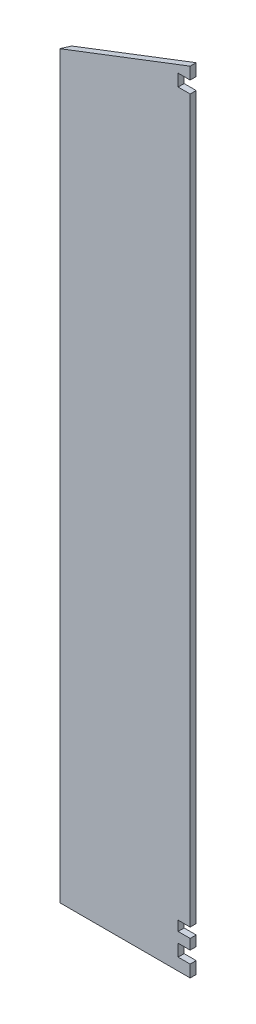
ISO-10303-21;
HEADER;
FILE_DESCRIPTION(('STEP AP214'),'2;1');
FILE_NAME('part.step','',(''),(''),'','','');
FILE_SCHEMA(('AUTOMOTIVE_DESIGN { 1 0 10303 214 1 1 1 1 }'));
ENDSEC;
DATA;
#1=APPLICATION_CONTEXT('core data for automotive mechanical design processes');
#2=APPLICATION_PROTOCOL_DEFINITION('international standard','automotive_design',2000,#1);
#3=PRODUCT_CONTEXT('',#1,'mechanical');
#4=PRODUCT('Part','Part','',(#3));
#5=PRODUCT_RELATED_PRODUCT_CATEGORY('part','',(#4));
#6=PRODUCT_DEFINITION_FORMATION('','',#4);
#7=PRODUCT_DEFINITION_CONTEXT('part definition',#1,'design');
#8=PRODUCT_DEFINITION('design','',#6,#7);
#9=PRODUCT_DEFINITION_SHAPE('','',#8);
#10=(LENGTH_UNIT() NAMED_UNIT(*) SI_UNIT(.MILLI.,.METRE.));
#11=(NAMED_UNIT(*) PLANE_ANGLE_UNIT() SI_UNIT($,.RADIAN.));
#12=(NAMED_UNIT(*) SI_UNIT($,.STERADIAN.) SOLID_ANGLE_UNIT());
#13=UNCERTAINTY_MEASURE_WITH_UNIT(LENGTH_MEASURE(1.E-05),#10,'distance_accuracy_value','');
#14=(GEOMETRIC_REPRESENTATION_CONTEXT(3) GLOBAL_UNCERTAINTY_ASSIGNED_CONTEXT((#13)) GLOBAL_UNIT_ASSIGNED_CONTEXT((#10,
#11,#12)) REPRESENTATION_CONTEXT('',''));
#15=CARTESIAN_POINT('',(0.,0.,0.));
#16=DIRECTION('',(0.,0.,1.));
#17=DIRECTION('',(1.,0.,0.));
#18=AXIS2_PLACEMENT_3D('',#15,#16,#17);
#19=CARTESIAN_POINT('',(173.,-1048.1,16.));
#20=DIRECTION('',(-1.,0.,0.));
#21=DIRECTION('',(0.,0.,1.));
#22=AXIS2_PLACEMENT_3D('',#19,#20,#21);
#23=PLANE('',#22);
#24=DIRECTION('',(0.,1.,0.));
#25=VECTOR('',#24,1.);
#26=CARTESIAN_POINT('',(173.,-1048.1,0.));
#27=LINE('',#26,#25);
#28=CARTESIAN_POINT('',(173.,-984.1,0.));
#29=VERTEX_POINT('',#28);
#30=CARTESIAN_POINT('',(173.,-957.1,0.));
#31=VERTEX_POINT('',#30);
#32=EDGE_CURVE('E170',#29,#31,#27,.T.);
#33=ORIENTED_EDGE('',*,*,#32,.T.);
#34=DIRECTION('',(0.,0.,1.));
#35=VECTOR('',#34,1.);
#36=CARTESIAN_POINT('',(173.,-957.1,0.));
#37=LINE('',#36,#35);
#38=CARTESIAN_POINT('',(173.,-957.1,16.));
#39=VERTEX_POINT('',#38);
#40=EDGE_CURVE('E403',#31,#39,#37,.T.);
#41=ORIENTED_EDGE('',*,*,#40,.T.);
#42=DIRECTION('',(0.,1.,0.));
#43=VECTOR('',#42,1.);
#44=CARTESIAN_POINT('',(173.,-1048.1,16.));
#45=LINE('',#44,#43);
#46=CARTESIAN_POINT('',(173.,-984.1,16.));
#47=VERTEX_POINT('',#46);
#48=EDGE_CURVE('E228',#47,#39,#45,.T.);
#49=ORIENTED_EDGE('',*,*,#48,.F.);
#50=DIRECTION('',(0.,0.,1.));
#51=VECTOR('',#50,1.);
#52=CARTESIAN_POINT('',(173.,-984.1,0.));
#53=LINE('',#52,#51);
#54=EDGE_CURVE('E254',#29,#47,#53,.T.);
#55=ORIENTED_EDGE('',*,*,#54,.F.);
#56=EDGE_LOOP('',(#33,#41,#49,#55));
#57=FACE_BOUND('',#56,.T.);
#58=ADVANCED_FACE('F33',(#57),#23,.F.);
#59=CARTESIAN_POINT('',(173.,-1048.1,0.));
#60=VERTEX_POINT('',#59);
#61=CARTESIAN_POINT('',(173.,-1016.1,0.));
#62=VERTEX_POINT('',#61);
#63=EDGE_CURVE('E173',#60,#62,#27,.T.);
#64=ORIENTED_EDGE('',*,*,#63,.T.);
#65=DIRECTION('',(0.,0.,1.));
#66=VECTOR('',#65,1.);
#67=CARTESIAN_POINT('',(173.,-1016.1,0.));
#68=LINE('',#67,#66);
#69=CARTESIAN_POINT('',(173.,-1016.1,16.));
#70=VERTEX_POINT('',#69);
#71=EDGE_CURVE('E237',#62,#70,#68,.T.);
#72=ORIENTED_EDGE('',*,*,#71,.T.);
#73=CARTESIAN_POINT('',(173.,-1048.1,16.));
#74=VERTEX_POINT('',#73);
#75=EDGE_CURVE('E225',#74,#70,#45,.T.);
#76=ORIENTED_EDGE('',*,*,#75,.F.);
#77=DIRECTION('',(0.,0.,-1.));
#78=VECTOR('',#77,1.);
#79=CARTESIAN_POINT('',(173.,-1048.1,16.));
#80=LINE('',#79,#78);
#81=EDGE_CURVE('E193',#74,#60,#80,.T.);
#82=ORIENTED_EDGE('',*,*,#81,.T.);
#83=EDGE_LOOP('',(#64,#72,#76,#82));
#84=FACE_BOUND('',#83,.T.);
#85=ADVANCED_FACE('F236',(#84),#23,.F.);
#86=CARTESIAN_POINT('',(173.,-931.1,16.));
#87=VERTEX_POINT('',#86);
#88=CARTESIAN_POINT('',(173.,984.1,16.));
#89=VERTEX_POINT('',#88);
#90=EDGE_CURVE('E161',#87,#89,#45,.T.);
#91=ORIENTED_EDGE('',*,*,#90,.F.);
#92=DIRECTION('',(0.,0.,1.));
#93=VECTOR('',#92,1.);
#94=CARTESIAN_POINT('',(173.,-931.1,0.));
#95=LINE('',#94,#93);
#96=CARTESIAN_POINT('',(173.,-931.1,0.));
#97=VERTEX_POINT('',#96);
#98=EDGE_CURVE('E148',#97,#87,#95,.T.);
#99=ORIENTED_EDGE('',*,*,#98,.F.);
#100=CARTESIAN_POINT('',(173.,984.1,0.));
#101=VERTEX_POINT('',#100);
#102=EDGE_CURVE('E159',#97,#101,#27,.T.);
#103=ORIENTED_EDGE('',*,*,#102,.T.);
#104=DIRECTION('',(0.,0.,1.));
#105=VECTOR('',#104,1.);
#106=CARTESIAN_POINT('',(173.,984.1,0.));
#107=LINE('',#106,#105);
#108=EDGE_CURVE('E217',#101,#89,#107,.T.);
#109=ORIENTED_EDGE('',*,*,#108,.T.);
#110=EDGE_LOOP('',(#91,#99,#103,#109));
#111=FACE_BOUND('',#110,.T.);
#112=ADVANCED_FACE('F157',(#111),#23,.F.);
#113=CARTESIAN_POINT('',(173.,1016.1,16.));
#114=VERTEX_POINT('',#113);
#115=CARTESIAN_POINT('',(173.,1048.1,16.));
#116=VERTEX_POINT('',#115);
#117=EDGE_CURVE('E190',#114,#116,#45,.T.);
#118=ORIENTED_EDGE('',*,*,#117,.F.);
#119=DIRECTION('',(0.,0.,1.));
#120=VECTOR('',#119,1.);
#121=CARTESIAN_POINT('',(173.,1016.1,0.));
#122=LINE('',#121,#120);
#123=CARTESIAN_POINT('',(173.,1016.1,0.));
#124=VERTEX_POINT('',#123);
#125=EDGE_CURVE('E204',#124,#114,#122,.T.);
#126=ORIENTED_EDGE('',*,*,#125,.F.);
#127=CARTESIAN_POINT('',(173.,1048.1,0.));
#128=VERTEX_POINT('',#127);
#129=EDGE_CURVE('E171',#124,#128,#27,.T.);
#130=ORIENTED_EDGE('',*,*,#129,.T.);
#131=DIRECTION('',(0.,0.,-1.));
#132=VECTOR('',#131,1.);
#133=CARTESIAN_POINT('',(173.,1048.1,16.));
#134=LINE('',#133,#132);
#135=EDGE_CURVE('E41',#116,#128,#134,.T.);
#136=ORIENTED_EDGE('',*,*,#135,.F.);
#137=EDGE_LOOP('',(#118,#126,#130,#136));
#138=FACE_BOUND('',#137,.T.);
#139=ADVANCED_FACE('F35',(#138),#23,.F.);
#140=CARTESIAN_POINT('',(173.,1048.1,16.));
#141=DIRECTION('',(0.358367949545305,-0.9335804264972,0.));
#142=DIRECTION('',(0.9335804264972,0.358367949545305,0.));
#143=AXIS2_PLACEMENT_3D('',#140,#141,#142);
#144=PLANE('',#143);
#145=DIRECTION('',(-0.9335804264972,-0.358367949545305,0.));
#146=VECTOR('',#145,1.);
#147=CARTESIAN_POINT('',(173.,1048.1,0.));
#148=LINE('',#147,#146);
#149=CARTESIAN_POINT('',(-157.,921.424868438311,0.));
#150=VERTEX_POINT('',#149);
#151=EDGE_CURVE('E179',#128,#150,#148,.T.);
#152=ORIENTED_EDGE('',*,*,#151,.T.);
#153=DIRECTION('',(-0.682414773418215,-0.261954488492099,0.682414773418197));
#154=VECTOR('',#153,1.);
#155=CARTESIAN_POINT('',(11.8712866491245,986.248481933067,-168.87128664912));
#156=LINE('',#155,#154);
#157=CARTESIAN_POINT('',(-173.,915.283043877744,16.));
#158=VERTEX_POINT('',#157);
#159=EDGE_CURVE('E175',#150,#158,#156,.T.);
#160=ORIENTED_EDGE('',*,*,#159,.T.);
#161=DIRECTION('',(-0.9335804264972,-0.358367949545305,0.));
#162=VECTOR('',#161,1.);
#163=CARTESIAN_POINT('',(173.,1048.1,16.));
#164=LINE('',#163,#162);
#165=EDGE_CURVE('E199',#116,#158,#164,.T.);
#166=ORIENTED_EDGE('',*,*,#165,.F.);
#167=ORIENTED_EDGE('',*,*,#135,.T.);
#168=EDGE_LOOP('',(#152,#160,#166,#167));
#169=FACE_BOUND('',#168,.T.);
#170=ADVANCED_FACE('F197',(#169),#144,.F.);
#171=CARTESIAN_POINT('',(-173.,-1048.1,16.));
#172=DIRECTION('',(0.,1.,0.));
#173=DIRECTION('',(0.,0.,1.));
#174=AXIS2_PLACEMENT_3D('',#171,#172,#173);
#175=PLANE('',#174);
#176=DIRECTION('',(1.,0.,0.));
#177=VECTOR('',#176,1.);
#178=CARTESIAN_POINT('',(-173.,-1048.1,16.));
#179=LINE('',#178,#177);
#180=CARTESIAN_POINT('',(-173.,-1048.1,16.));
#181=VERTEX_POINT('',#180);
#182=EDGE_CURVE('E194',#181,#74,#179,.T.);
#183=ORIENTED_EDGE('',*,*,#182,.F.);
#184=DIRECTION('',(-0.707106781186557,0.,0.707106781186538));
#185=VECTOR('',#184,1.);
#186=CARTESIAN_POINT('',(-173.,-1048.1,16.));
#187=LINE('',#186,#185);
#188=CARTESIAN_POINT('',(-157.,-1048.1,0.));
#189=VERTEX_POINT('',#188);
#190=EDGE_CURVE('E211',#189,#181,#187,.T.);
#191=ORIENTED_EDGE('',*,*,#190,.F.);
#192=DIRECTION('',(1.,0.,0.));
#193=VECTOR('',#192,1.);
#194=CARTESIAN_POINT('',(-173.,-1048.1,0.));
#195=LINE('',#194,#193);
#196=EDGE_CURVE('E185',#189,#60,#195,.T.);
#197=ORIENTED_EDGE('',*,*,#196,.T.);
#198=ORIENTED_EDGE('',*,*,#81,.F.);
#199=EDGE_LOOP('',(#183,#191,#197,#198));
#200=FACE_BOUND('',#199,.T.);
#201=ADVANCED_FACE('F215',(#200),#175,.F.);
#202=CARTESIAN_POINT('',(0.,0.,16.));
#203=DIRECTION('',(0.,0.,-1.));
#204=DIRECTION('',(-1.,0.,0.));
#205=AXIS2_PLACEMENT_3D('',#202,#203,#204);
#206=PLANE('',#205);
#207=ORIENTED_EDGE('',*,*,#48,.T.);
#208=DIRECTION('',(1.,0.,0.));
#209=VECTOR('',#208,1.);
#210=CARTESIAN_POINT('',(173.,-957.1,16.));
#211=LINE('',#210,#209);
#212=CARTESIAN_POINT('',(141.,-957.1,16.));
#213=VERTEX_POINT('',#212);
#214=EDGE_CURVE('E153',#213,#39,#211,.T.);
#215=ORIENTED_EDGE('',*,*,#214,.F.);
#216=DIRECTION('',(0.,-1.,0.));
#217=VECTOR('',#216,1.);
#218=CARTESIAN_POINT('',(141.,-957.1,16.));
#219=LINE('',#218,#217);
#220=CARTESIAN_POINT('',(141.,-931.1,16.));
#221=VERTEX_POINT('',#220);
#222=EDGE_CURVE('E391',#221,#213,#219,.T.);
#223=ORIENTED_EDGE('',*,*,#222,.F.);
#224=DIRECTION('',(-1.,0.,0.));
#225=VECTOR('',#224,1.);
#226=CARTESIAN_POINT('',(141.,-931.1,16.));
#227=LINE('',#226,#225);
#228=EDGE_CURVE('E395',#87,#221,#227,.T.);
#229=ORIENTED_EDGE('',*,*,#228,.F.);
#230=ORIENTED_EDGE('',*,*,#90,.T.);
#231=DIRECTION('',(1.,0.,0.));
#232=VECTOR('',#231,1.);
#233=CARTESIAN_POINT('',(173.,984.1,16.));
#234=LINE('',#233,#232);
#235=CARTESIAN_POINT('',(141.,984.1,16.));
#236=VERTEX_POINT('',#235);
#237=EDGE_CURVE('E260',#236,#89,#234,.T.);
#238=ORIENTED_EDGE('',*,*,#237,.F.);
#239=DIRECTION('',(0.,-1.,0.));
#240=VECTOR('',#239,1.);
#241=CARTESIAN_POINT('',(141.,1016.1,16.));
#242=LINE('',#241,#240);
#243=CARTESIAN_POINT('',(141.,1016.1,16.));
#244=VERTEX_POINT('',#243);
#245=EDGE_CURVE('E245',#244,#236,#242,.T.);
#246=ORIENTED_EDGE('',*,*,#245,.F.);
#247=DIRECTION('',(-1.,0.,0.));
#248=VECTOR('',#247,1.);
#249=CARTESIAN_POINT('',(173.,1016.1,16.));
#250=LINE('',#249,#248);
#251=EDGE_CURVE('E241',#114,#244,#250,.T.);
#252=ORIENTED_EDGE('',*,*,#251,.F.);
#253=ORIENTED_EDGE('',*,*,#117,.T.);
#254=ORIENTED_EDGE('',*,*,#165,.T.);
#255=DIRECTION('',(0.,-1.,0.));
#256=VECTOR('',#255,1.);
#257=CARTESIAN_POINT('',(-173.,915.283043877744,16.));
#258=LINE('',#257,#256);
#259=EDGE_CURVE('E230',#158,#181,#258,.T.);
#260=ORIENTED_EDGE('',*,*,#259,.T.);
#261=ORIENTED_EDGE('',*,*,#182,.T.);
#262=ORIENTED_EDGE('',*,*,#75,.T.);
#263=DIRECTION('',(1.,0.,0.));
#264=VECTOR('',#263,1.);
#265=CARTESIAN_POINT('',(173.,-1016.1,16.));
#266=LINE('',#265,#264);
#267=CARTESIAN_POINT('',(141.,-1016.1,16.));
#268=VERTEX_POINT('',#267);
#269=EDGE_CURVE('E250',#268,#70,#266,.T.);
#270=ORIENTED_EDGE('',*,*,#269,.F.);
#271=DIRECTION('',(0.,-1.,0.));
#272=VECTOR('',#271,1.);
#273=CARTESIAN_POINT('',(141.,-984.1,16.));
#274=LINE('',#273,#272);
#275=CARTESIAN_POINT('',(141.,-984.1,16.));
#276=VERTEX_POINT('',#275);
#277=EDGE_CURVE('E414',#276,#268,#274,.T.);
#278=ORIENTED_EDGE('',*,*,#277,.F.);
#279=DIRECTION('',(-1.,0.,0.));
#280=VECTOR('',#279,1.);
#281=CARTESIAN_POINT('',(173.,-984.1,16.));
#282=LINE('',#281,#280);
#283=EDGE_CURVE('E405',#47,#276,#282,.T.);
#284=ORIENTED_EDGE('',*,*,#283,.F.);
#285=EDGE_LOOP('',(#207,#215,#223,#229,#230,#238,#246,#252,#253,#254,#260,#261,#262,#270,#278,#284));
#286=FACE_BOUND('',#285,.T.);
#287=ADVANCED_FACE('F233',(#286),#206,.F.);
#288=CARTESIAN_POINT('',(0.,0.,0.));
#289=DIRECTION('',(0.,0.,-1.));
#290=DIRECTION('',(-1.,0.,0.));
#291=AXIS2_PLACEMENT_3D('',#288,#289,#290);
#292=PLANE('',#291);
#293=DIRECTION('',(1.,0.,0.));
#294=VECTOR('',#293,1.);
#295=CARTESIAN_POINT('',(173.,-957.1,0.));
#296=LINE('',#295,#294);
#297=CARTESIAN_POINT('',(141.,-957.1,0.));
#298=VERTEX_POINT('',#297);
#299=EDGE_CURVE('E162',#298,#31,#296,.T.);
#300=ORIENTED_EDGE('',*,*,#299,.T.);
#301=ORIENTED_EDGE('',*,*,#32,.F.);
#302=DIRECTION('',(-1.,0.,0.));
#303=VECTOR('',#302,1.);
#304=CARTESIAN_POINT('',(173.,-984.1,0.));
#305=LINE('',#304,#303);
#306=CARTESIAN_POINT('',(141.,-984.1,0.));
#307=VERTEX_POINT('',#306);
#308=EDGE_CURVE('E408',#29,#307,#305,.T.);
#309=ORIENTED_EDGE('',*,*,#308,.T.);
#310=DIRECTION('',(0.,-1.,0.));
#311=VECTOR('',#310,1.);
#312=CARTESIAN_POINT('',(141.,-984.1,0.));
#313=LINE('',#312,#311);
#314=CARTESIAN_POINT('',(141.,-1016.1,0.));
#315=VERTEX_POINT('',#314);
#316=EDGE_CURVE('E56',#307,#315,#313,.T.);
#317=ORIENTED_EDGE('',*,*,#316,.T.);
#318=DIRECTION('',(1.,0.,0.));
#319=VECTOR('',#318,1.);
#320=CARTESIAN_POINT('',(173.,-1016.1,0.));
#321=LINE('',#320,#319);
#322=EDGE_CURVE('E256',#315,#62,#321,.T.);
#323=ORIENTED_EDGE('',*,*,#322,.T.);
#324=ORIENTED_EDGE('',*,*,#63,.F.);
#325=ORIENTED_EDGE('',*,*,#196,.F.);
#326=DIRECTION('',(0.,-1.,0.));
#327=VECTOR('',#326,1.);
#328=CARTESIAN_POINT('',(-157.,0.,0.));
#329=LINE('',#328,#327);
#330=EDGE_CURVE('E11',#150,#189,#329,.T.);
#331=ORIENTED_EDGE('',*,*,#330,.F.);
#332=ORIENTED_EDGE('',*,*,#151,.F.);
#333=ORIENTED_EDGE('',*,*,#129,.F.);
#334=DIRECTION('',(-1.,0.,0.));
#335=VECTOR('',#334,1.);
#336=CARTESIAN_POINT('',(173.,1016.1,0.));
#337=LINE('',#336,#335);
#338=CARTESIAN_POINT('',(141.,1016.1,0.));
#339=VERTEX_POINT('',#338);
#340=EDGE_CURVE('E257',#124,#339,#337,.T.);
#341=ORIENTED_EDGE('',*,*,#340,.T.);
#342=DIRECTION('',(0.,-1.,0.));
#343=VECTOR('',#342,1.);
#344=CARTESIAN_POINT('',(141.,1016.1,0.));
#345=LINE('',#344,#343);
#346=CARTESIAN_POINT('',(141.,984.1,0.));
#347=VERTEX_POINT('',#346);
#348=EDGE_CURVE('E259',#339,#347,#345,.T.);
#349=ORIENTED_EDGE('',*,*,#348,.T.);
#350=DIRECTION('',(1.,0.,0.));
#351=VECTOR('',#350,1.);
#352=CARTESIAN_POINT('',(173.,984.1,0.));
#353=LINE('',#352,#351);
#354=EDGE_CURVE('E169',#347,#101,#353,.T.);
#355=ORIENTED_EDGE('',*,*,#354,.T.);
#356=ORIENTED_EDGE('',*,*,#102,.F.);
#357=DIRECTION('',(-1.,0.,0.));
#358=VECTOR('',#357,1.);
#359=CARTESIAN_POINT('',(141.,-931.1,0.));
#360=LINE('',#359,#358);
#361=CARTESIAN_POINT('',(141.,-931.1,0.));
#362=VERTEX_POINT('',#361);
#363=EDGE_CURVE('E144',#97,#362,#360,.T.);
#364=ORIENTED_EDGE('',*,*,#363,.T.);
#365=DIRECTION('',(0.,-1.,0.));
#366=VECTOR('',#365,1.);
#367=CARTESIAN_POINT('',(141.,-957.1,0.));
#368=LINE('',#367,#366);
#369=EDGE_CURVE('E48',#362,#298,#368,.T.);
#370=ORIENTED_EDGE('',*,*,#369,.T.);
#371=EDGE_LOOP('',(#300,#301,#309,#317,#323,#324,#325,#331,#332,#333,#341,#349,#355,#356,#364,#370));
#372=FACE_BOUND('',#371,.T.);
#373=ADVANCED_FACE('F166',(#372),#292,.T.);
#374=CARTESIAN_POINT('',(-173.,1048.1,16.));
#375=DIRECTION('',(0.707106781186538,0.,0.707106781186557));
#376=DIRECTION('',(0.707106781186557,0.,-0.707106781186538));
#377=AXIS2_PLACEMENT_3D('',#374,#375,#376);
#378=PLANE('',#377);
#379=ORIENTED_EDGE('',*,*,#330,.T.);
#380=ORIENTED_EDGE('',*,*,#190,.T.);
#381=ORIENTED_EDGE('',*,*,#259,.F.);
#382=ORIENTED_EDGE('',*,*,#159,.F.);
#383=EDGE_LOOP('',(#379,#380,#381,#382));
#384=FACE_BOUND('',#383,.T.);
#385=ADVANCED_FACE('F210',(#384),#378,.F.);
#386=CARTESIAN_POINT('',(173.,984.1,0.));
#387=DIRECTION('',(0.,-1.,0.));
#388=DIRECTION('',(0.,0.,-1.));
#389=AXIS2_PLACEMENT_3D('',#386,#387,#388);
#390=PLANE('',#389);
#391=ORIENTED_EDGE('',*,*,#237,.T.);
#392=ORIENTED_EDGE('',*,*,#108,.F.);
#393=ORIENTED_EDGE('',*,*,#354,.F.);
#394=DIRECTION('',(0.,0.,1.));
#395=VECTOR('',#394,1.);
#396=CARTESIAN_POINT('',(141.,984.1,0.));
#397=LINE('',#396,#395);
#398=EDGE_CURVE('E220',#347,#236,#397,.T.);
#399=ORIENTED_EDGE('',*,*,#398,.T.);
#400=EDGE_LOOP('',(#391,#392,#393,#399));
#401=FACE_BOUND('',#400,.T.);
#402=ADVANCED_FACE('F277',(#401),#390,.F.);
#403=CARTESIAN_POINT('',(141.,1016.1,0.));
#404=DIRECTION('',(-1.,0.,0.));
#405=DIRECTION('',(0.,0.,1.));
#406=AXIS2_PLACEMENT_3D('',#403,#404,#405);
#407=PLANE('',#406);
#408=ORIENTED_EDGE('',*,*,#245,.T.);
#409=ORIENTED_EDGE('',*,*,#398,.F.);
#410=ORIENTED_EDGE('',*,*,#348,.F.);
#411=DIRECTION('',(0.,0.,1.));
#412=VECTOR('',#411,1.);
#413=CARTESIAN_POINT('',(141.,1016.1,0.));
#414=LINE('',#413,#412);
#415=EDGE_CURVE('E267',#339,#244,#414,.T.);
#416=ORIENTED_EDGE('',*,*,#415,.T.);
#417=EDGE_LOOP('',(#408,#409,#410,#416));
#418=FACE_BOUND('',#417,.T.);
#419=ADVANCED_FACE('F275',(#418),#407,.F.);
#420=CARTESIAN_POINT('',(173.,1016.1,0.));
#421=DIRECTION('',(0.,1.,0.));
#422=DIRECTION('',(0.,0.,1.));
#423=AXIS2_PLACEMENT_3D('',#420,#421,#422);
#424=PLANE('',#423);
#425=ORIENTED_EDGE('',*,*,#251,.T.);
#426=ORIENTED_EDGE('',*,*,#415,.F.);
#427=ORIENTED_EDGE('',*,*,#340,.F.);
#428=ORIENTED_EDGE('',*,*,#125,.T.);
#429=EDGE_LOOP('',(#425,#426,#427,#428));
#430=FACE_BOUND('',#429,.T.);
#431=ADVANCED_FACE('F272',(#430),#424,.F.);
#432=CARTESIAN_POINT('',(173.,-1016.1,0.));
#433=DIRECTION('',(0.,-1.,0.));
#434=DIRECTION('',(0.,0.,-1.));
#435=AXIS2_PLACEMENT_3D('',#432,#433,#434);
#436=PLANE('',#435);
#437=ORIENTED_EDGE('',*,*,#269,.T.);
#438=ORIENTED_EDGE('',*,*,#71,.F.);
#439=ORIENTED_EDGE('',*,*,#322,.F.);
#440=DIRECTION('',(0.,0.,1.));
#441=VECTOR('',#440,1.);
#442=CARTESIAN_POINT('',(141.,-1016.1,0.));
#443=LINE('',#442,#441);
#444=EDGE_CURVE('E242',#315,#268,#443,.T.);
#445=ORIENTED_EDGE('',*,*,#444,.T.);
#446=EDGE_LOOP('',(#437,#438,#439,#445));
#447=FACE_BOUND('',#446,.T.);
#448=ADVANCED_FACE('F332',(#447),#436,.F.);
#449=CARTESIAN_POINT('',(141.,-984.1,0.));
#450=DIRECTION('',(-1.,0.,0.));
#451=DIRECTION('',(0.,0.,1.));
#452=AXIS2_PLACEMENT_3D('',#449,#450,#451);
#453=PLANE('',#452);
#454=ORIENTED_EDGE('',*,*,#277,.T.);
#455=ORIENTED_EDGE('',*,*,#444,.F.);
#456=ORIENTED_EDGE('',*,*,#316,.F.);
#457=DIRECTION('',(0.,0.,1.));
#458=VECTOR('',#457,1.);
#459=CARTESIAN_POINT('',(141.,-984.1,0.));
#460=LINE('',#459,#458);
#461=EDGE_CURVE('E247',#307,#276,#460,.T.);
#462=ORIENTED_EDGE('',*,*,#461,.T.);
#463=EDGE_LOOP('',(#454,#455,#456,#462));
#464=FACE_BOUND('',#463,.T.);
#465=ADVANCED_FACE('F340',(#464),#453,.F.);
#466=CARTESIAN_POINT('',(173.,-984.1,0.));
#467=DIRECTION('',(0.,1.,0.));
#468=DIRECTION('',(0.,0.,1.));
#469=AXIS2_PLACEMENT_3D('',#466,#467,#468);
#470=PLANE('',#469);
#471=ORIENTED_EDGE('',*,*,#283,.T.);
#472=ORIENTED_EDGE('',*,*,#461,.F.);
#473=ORIENTED_EDGE('',*,*,#308,.F.);
#474=ORIENTED_EDGE('',*,*,#54,.T.);
#475=EDGE_LOOP('',(#471,#472,#473,#474));
#476=FACE_BOUND('',#475,.T.);
#477=ADVANCED_FACE('F348',(#476),#470,.F.);
#478=CARTESIAN_POINT('',(173.,-957.1,0.));
#479=DIRECTION('',(0.,-1.,0.));
#480=DIRECTION('',(0.,0.,-1.));
#481=AXIS2_PLACEMENT_3D('',#478,#479,#480);
#482=PLANE('',#481);
#483=ORIENTED_EDGE('',*,*,#214,.T.);
#484=ORIENTED_EDGE('',*,*,#40,.F.);
#485=ORIENTED_EDGE('',*,*,#299,.F.);
#486=DIRECTION('',(0.,0.,1.));
#487=VECTOR('',#486,1.);
#488=CARTESIAN_POINT('',(141.,-957.1,0.));
#489=LINE('',#488,#487);
#490=EDGE_CURVE('E393',#298,#213,#489,.T.);
#491=ORIENTED_EDGE('',*,*,#490,.T.);
#492=EDGE_LOOP('',(#483,#484,#485,#491));
#493=FACE_BOUND('',#492,.T.);
#494=ADVANCED_FACE('F356',(#493),#482,.F.);
#495=CARTESIAN_POINT('',(141.,-957.1,0.));
#496=DIRECTION('',(-1.,0.,0.));
#497=DIRECTION('',(0.,0.,1.));
#498=AXIS2_PLACEMENT_3D('',#495,#496,#497);
#499=PLANE('',#498);
#500=ORIENTED_EDGE('',*,*,#222,.T.);
#501=ORIENTED_EDGE('',*,*,#490,.F.);
#502=ORIENTED_EDGE('',*,*,#369,.F.);
#503=DIRECTION('',(0.,0.,1.));
#504=VECTOR('',#503,1.);
#505=CARTESIAN_POINT('',(141.,-931.1,0.));
#506=LINE('',#505,#504);
#507=EDGE_CURVE('E150',#362,#221,#506,.T.);
#508=ORIENTED_EDGE('',*,*,#507,.T.);
#509=EDGE_LOOP('',(#500,#501,#502,#508));
#510=FACE_BOUND('',#509,.T.);
#511=ADVANCED_FACE('F364',(#510),#499,.F.);
#512=CARTESIAN_POINT('',(141.,-931.1,0.));
#513=DIRECTION('',(0.,1.,0.));
#514=DIRECTION('',(0.,0.,1.));
#515=AXIS2_PLACEMENT_3D('',#512,#513,#514);
#516=PLANE('',#515);
#517=ORIENTED_EDGE('',*,*,#228,.T.);
#518=ORIENTED_EDGE('',*,*,#507,.F.);
#519=ORIENTED_EDGE('',*,*,#363,.F.);
#520=ORIENTED_EDGE('',*,*,#98,.T.);
#521=EDGE_LOOP('',(#517,#518,#519,#520));
#522=FACE_BOUND('',#521,.T.);
#523=ADVANCED_FACE('F147',(#522),#516,.F.);
#524=CLOSED_SHELL('',(#58,#85,#112,#139,#170,#201,#287,#373,#385,#402,#419,#431,#448,#465,#477,
#494,#511,#523));
#525=MANIFOLD_SOLID_BREP('B2',#524);
#526=ADVANCED_BREP_SHAPE_REPRESENTATION('',(#18,#525),#14);
#527=SHAPE_DEFINITION_REPRESENTATION(#9,#526);
ENDSEC;
END-ISO-10303-21;
